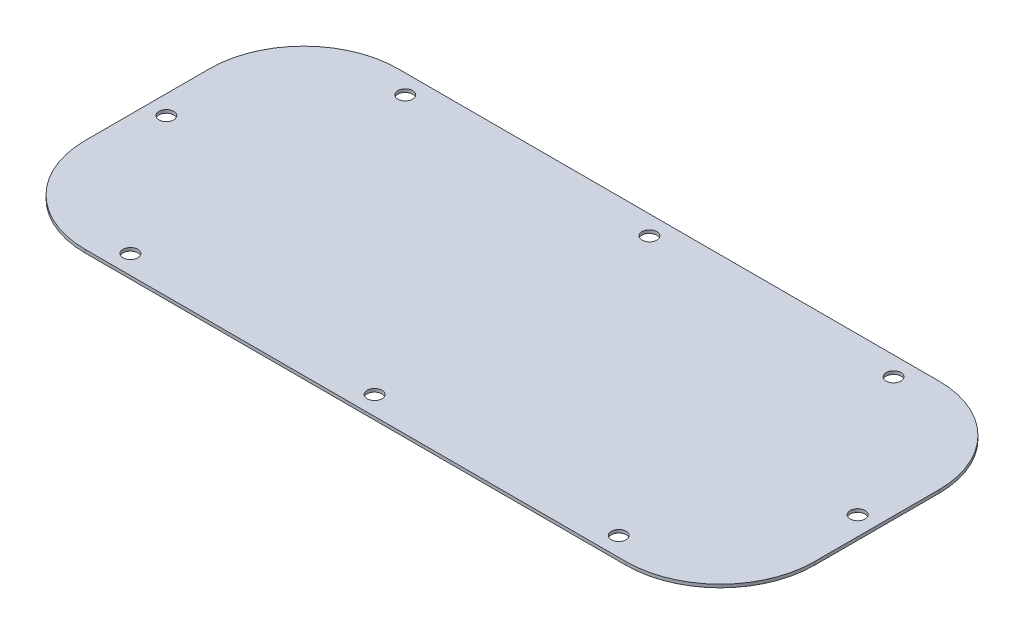
ISO-10303-21;
HEADER;
FILE_DESCRIPTION(('STEP AP214'),'2;1');
FILE_NAME('part.step','',(''),(''),'','','');
FILE_SCHEMA(('AUTOMOTIVE_DESIGN { 1 0 10303 214 1 1 1 1 }'));
ENDSEC;
DATA;
#1=APPLICATION_CONTEXT('core data for automotive mechanical design processes');
#2=APPLICATION_PROTOCOL_DEFINITION('international standard','automotive_design',2000,#1);
#3=PRODUCT_CONTEXT('',#1,'mechanical');
#4=PRODUCT('Part','Part','',(#3));
#5=PRODUCT_RELATED_PRODUCT_CATEGORY('part','',(#4));
#6=PRODUCT_DEFINITION_FORMATION('','',#4);
#7=PRODUCT_DEFINITION_CONTEXT('part definition',#1,'design');
#8=PRODUCT_DEFINITION('design','',#6,#7);
#9=PRODUCT_DEFINITION_SHAPE('','',#8);
#10=(LENGTH_UNIT() NAMED_UNIT(*) SI_UNIT(.MILLI.,.METRE.));
#11=(NAMED_UNIT(*) PLANE_ANGLE_UNIT() SI_UNIT($,.RADIAN.));
#12=(NAMED_UNIT(*) SI_UNIT($,.STERADIAN.) SOLID_ANGLE_UNIT());
#13=UNCERTAINTY_MEASURE_WITH_UNIT(LENGTH_MEASURE(1.E-05),#10,'distance_accuracy_value','');
#14=(GEOMETRIC_REPRESENTATION_CONTEXT(3) GLOBAL_UNCERTAINTY_ASSIGNED_CONTEXT((#13)) GLOBAL_UNIT_ASSIGNED_CONTEXT((#10,
#11,#12)) REPRESENTATION_CONTEXT('',''));
#15=CARTESIAN_POINT('',(0.,0.,0.));
#16=DIRECTION('',(0.,0.,1.));
#17=DIRECTION('',(1.,0.,0.));
#18=AXIS2_PLACEMENT_3D('',#15,#16,#17);
#19=CARTESIAN_POINT('',(72.,-1.5,118.5));
#20=DIRECTION('',(0.,1.,0.));
#21=DIRECTION('',(0.,0.,1.));
#22=AXIS2_PLACEMENT_3D('',#19,#20,#21);
#23=PLANE('',#22);
#24=DIRECTION('',(0.,0.,1.));
#25=VECTOR('',#24,1.);
#26=CARTESIAN_POINT('',(27.5,-1.5,118.5));
#27=LINE('',#26,#25);
#28=CARTESIAN_POINT('',(27.5,-1.5,59.5));
#29=VERTEX_POINT('',#28);
#30=CARTESIAN_POINT('',(27.5,-1.5,118.5));
#31=VERTEX_POINT('',#30);
#32=EDGE_CURVE('E84',#29,#31,#27,.T.);
#33=ORIENTED_EDGE('',*,*,#32,.F.);
#34=CARTESIAN_POINT('',(72.,-1.5,59.5));
#35=DIRECTION('',(0.,-1.,0.));
#36=DIRECTION('',(0.,0.,-1.));
#37=AXIS2_PLACEMENT_3D('',#34,#35,#36);
#38=CIRCLE('',#37,44.5);
#39=CARTESIAN_POINT('',(72.,-1.5,15.));
#40=VERTEX_POINT('',#39);
#41=EDGE_CURVE('E103',#40,#29,#38,.F.);
#42=ORIENTED_EDGE('',*,*,#41,.F.);
#43=DIRECTION('',(1.,0.,0.));
#44=VECTOR('',#43,1.);
#45=CARTESIAN_POINT('',(328.,-1.5,15.));
#46=LINE('',#45,#44);
#47=CARTESIAN_POINT('',(328.,-1.5,15.));
#48=VERTEX_POINT('',#47);
#49=EDGE_CURVE('E108',#40,#48,#46,.T.);
#50=ORIENTED_EDGE('',*,*,#49,.T.);
#51=CARTESIAN_POINT('',(328.,-1.5,59.5));
#52=DIRECTION('',(0.,-1.,0.));
#53=DIRECTION('',(0.,0.,-1.));
#54=AXIS2_PLACEMENT_3D('',#51,#52,#53);
#55=CIRCLE('',#54,44.5);
#56=CARTESIAN_POINT('',(372.5,-1.5,59.5));
#57=VERTEX_POINT('',#56);
#58=EDGE_CURVE('E115',#57,#48,#55,.F.);
#59=ORIENTED_EDGE('',*,*,#58,.F.);
#60=DIRECTION('',(0.,0.,1.));
#61=VECTOR('',#60,1.);
#62=CARTESIAN_POINT('',(372.5,-1.5,118.5));
#63=LINE('',#62,#61);
#64=CARTESIAN_POINT('',(372.5,-1.5,118.5));
#65=VERTEX_POINT('',#64);
#66=EDGE_CURVE('E112',#57,#65,#63,.T.);
#67=ORIENTED_EDGE('',*,*,#66,.T.);
#68=CARTESIAN_POINT('',(328.,-1.5,118.5));
#69=DIRECTION('',(0.,-1.,0.));
#70=DIRECTION('',(0.,0.,-1.));
#71=AXIS2_PLACEMENT_3D('',#68,#69,#70);
#72=CIRCLE('',#71,44.5);
#73=CARTESIAN_POINT('',(328.,-1.5,163.));
#74=VERTEX_POINT('',#73);
#75=EDGE_CURVE('E118',#74,#65,#72,.F.);
#76=ORIENTED_EDGE('',*,*,#75,.F.);
#77=DIRECTION('',(1.,0.,0.));
#78=VECTOR('',#77,1.);
#79=CARTESIAN_POINT('',(72.,-1.5,163.));
#80=LINE('',#79,#78);
#81=CARTESIAN_POINT('',(72.,-1.5,163.));
#82=VERTEX_POINT('',#81);
#83=EDGE_CURVE('E86',#74,#82,#80,.F.);
#84=ORIENTED_EDGE('',*,*,#83,.T.);
#85=CARTESIAN_POINT('',(72.,-1.5,118.5));
#86=DIRECTION('',(0.,-1.,0.));
#87=DIRECTION('',(0.,0.,-1.));
#88=AXIS2_PLACEMENT_3D('',#85,#86,#87);
#89=CIRCLE('',#88,44.5);
#90=EDGE_CURVE('E80',#31,#82,#89,.F.);
#91=ORIENTED_EDGE('',*,*,#90,.F.);
#92=EDGE_LOOP('',(#33,#42,#50,#59,#67,#76,#84,#91));
#93=FACE_BOUND('',#92,.T.);
#94=CARTESIAN_POINT('',(36.5,-1.5,89.));
#95=DIRECTION('',(0.,1.,0.));
#96=DIRECTION('',(0.,0.,1.));
#97=AXIS2_PLACEMENT_3D('',#94,#95,#96);
#98=CIRCLE('',#97,3.5);
#99=CARTESIAN_POINT('',(36.5,-1.5,92.5));
#100=VERTEX_POINT('',#99);
#101=EDGE_CURVE('E90',#100,#100,#98,.T.);
#102=ORIENTED_EDGE('',*,*,#101,.T.);
#103=EDGE_LOOP('',(#102));
#104=FACE_BOUND('',#103,.T.);
#105=CARTESIAN_POINT('',(363.5,-1.5,89.));
#106=DIRECTION('',(0.,1.,0.));
#107=DIRECTION('',(0.,0.,1.));
#108=AXIS2_PLACEMENT_3D('',#105,#106,#107);
#109=CIRCLE('',#108,3.5);
#110=CARTESIAN_POINT('',(363.5,-1.5,92.5));
#111=VERTEX_POINT('',#110);
#112=EDGE_CURVE('E162',#111,#111,#109,.T.);
#113=ORIENTED_EDGE('',*,*,#112,.T.);
#114=EDGE_LOOP('',(#113));
#115=FACE_BOUND('',#114,.T.);
#116=CARTESIAN_POINT('',(84.5,-1.5,24.));
#117=DIRECTION('',(0.,1.,0.));
#118=DIRECTION('',(0.,0.,1.));
#119=AXIS2_PLACEMENT_3D('',#116,#117,#118);
#120=CIRCLE('',#119,3.5);
#121=CARTESIAN_POINT('',(84.5,-1.5,27.5));
#122=VERTEX_POINT('',#121);
#123=EDGE_CURVE('E165',#122,#122,#120,.T.);
#124=ORIENTED_EDGE('',*,*,#123,.T.);
#125=EDGE_LOOP('',(#124));
#126=FACE_BOUND('',#125,.T.);
#127=CARTESIAN_POINT('',(84.5,-1.5,154.));
#128=DIRECTION('',(0.,1.,0.));
#129=DIRECTION('',(0.,0.,1.));
#130=AXIS2_PLACEMENT_3D('',#127,#128,#129);
#131=CIRCLE('',#130,3.5);
#132=CARTESIAN_POINT('',(84.5,-1.5,157.5));
#133=VERTEX_POINT('',#132);
#134=EDGE_CURVE('E168',#133,#133,#131,.T.);
#135=ORIENTED_EDGE('',*,*,#134,.T.);
#136=EDGE_LOOP('',(#135));
#137=FACE_BOUND('',#136,.T.);
#138=CARTESIAN_POINT('',(200.,-1.5,24.));
#139=DIRECTION('',(0.,1.,0.));
#140=DIRECTION('',(0.,0.,1.));
#141=AXIS2_PLACEMENT_3D('',#138,#139,#140);
#142=CIRCLE('',#141,3.5);
#143=CARTESIAN_POINT('',(200.,-1.5,27.5));
#144=VERTEX_POINT('',#143);
#145=EDGE_CURVE('E171',#144,#144,#142,.T.);
#146=ORIENTED_EDGE('',*,*,#145,.T.);
#147=EDGE_LOOP('',(#146));
#148=FACE_BOUND('',#147,.T.);
#149=CARTESIAN_POINT('',(200.,-1.5,154.));
#150=DIRECTION('',(0.,1.,0.));
#151=DIRECTION('',(0.,0.,1.));
#152=AXIS2_PLACEMENT_3D('',#149,#150,#151);
#153=CIRCLE('',#152,3.5);
#154=CARTESIAN_POINT('',(200.,-1.5,157.5));
#155=VERTEX_POINT('',#154);
#156=EDGE_CURVE('E174',#155,#155,#153,.T.);
#157=ORIENTED_EDGE('',*,*,#156,.T.);
#158=EDGE_LOOP('',(#157));
#159=FACE_BOUND('',#158,.T.);
#160=CARTESIAN_POINT('',(315.5,-1.5,24.));
#161=DIRECTION('',(0.,1.,0.));
#162=DIRECTION('',(0.,0.,1.));
#163=AXIS2_PLACEMENT_3D('',#160,#161,#162);
#164=CIRCLE('',#163,3.5);
#165=CARTESIAN_POINT('',(315.5,-1.5,27.5));
#166=VERTEX_POINT('',#165);
#167=EDGE_CURVE('E176',#166,#166,#164,.T.);
#168=ORIENTED_EDGE('',*,*,#167,.T.);
#169=EDGE_LOOP('',(#168));
#170=FACE_BOUND('',#169,.T.);
#171=CARTESIAN_POINT('',(315.5,-1.5,154.));
#172=DIRECTION('',(0.,1.,0.));
#173=DIRECTION('',(0.,0.,1.));
#174=AXIS2_PLACEMENT_3D('',#171,#172,#173);
#175=CIRCLE('',#174,3.5);
#176=CARTESIAN_POINT('',(315.5,-1.5,157.5));
#177=VERTEX_POINT('',#176);
#178=EDGE_CURVE('E20',#177,#177,#175,.T.);
#179=ORIENTED_EDGE('',*,*,#178,.T.);
#180=EDGE_LOOP('',(#179));
#181=FACE_BOUND('',#180,.T.);
#182=ADVANCED_FACE('F17',(#93,#104,#115,#126,#137,#148,#159,#170,#181),#23,.F.);
#183=CARTESIAN_POINT('',(315.5,-3.7,154.));
#184=DIRECTION('',(0.,1.,0.));
#185=DIRECTION('',(0.,0.,1.));
#186=AXIS2_PLACEMENT_3D('',#183,#184,#185);
#187=CYLINDRICAL_SURFACE('',#186,3.5);
#188=CARTESIAN_POINT('',(315.5,0.,154.));
#189=DIRECTION('',(0.,1.,0.));
#190=DIRECTION('',(0.,0.,1.));
#191=AXIS2_PLACEMENT_3D('',#188,#189,#190);
#192=CIRCLE('',#191,3.5);
#193=CARTESIAN_POINT('',(315.5,0.,157.5));
#194=VERTEX_POINT('',#193);
#195=EDGE_CURVE('E152',#194,#194,#192,.F.);
#196=ORIENTED_EDGE('',*,*,#195,.F.);
#197=EDGE_LOOP('',(#196));
#198=FACE_BOUND('',#197,.T.);
#199=ORIENTED_EDGE('',*,*,#178,.F.);
#200=EDGE_LOOP('',(#199));
#201=FACE_BOUND('',#200,.T.);
#202=ADVANCED_FACE('F184',(#198,#201),#187,.F.);
#203=CARTESIAN_POINT('',(315.5,-3.7,24.));
#204=DIRECTION('',(0.,1.,0.));
#205=DIRECTION('',(0.,0.,1.));
#206=AXIS2_PLACEMENT_3D('',#203,#204,#205);
#207=CYLINDRICAL_SURFACE('',#206,3.5);
#208=CARTESIAN_POINT('',(315.5,0.,24.));
#209=DIRECTION('',(0.,1.,0.));
#210=DIRECTION('',(0.,0.,1.));
#211=AXIS2_PLACEMENT_3D('',#208,#209,#210);
#212=CIRCLE('',#211,3.5);
#213=CARTESIAN_POINT('',(315.5,0.,27.5));
#214=VERTEX_POINT('',#213);
#215=EDGE_CURVE('E149',#214,#214,#212,.F.);
#216=ORIENTED_EDGE('',*,*,#215,.F.);
#217=EDGE_LOOP('',(#216));
#218=FACE_BOUND('',#217,.T.);
#219=ORIENTED_EDGE('',*,*,#167,.F.);
#220=EDGE_LOOP('',(#219));
#221=FACE_BOUND('',#220,.T.);
#222=ADVANCED_FACE('F186',(#218,#221),#207,.F.);
#223=CARTESIAN_POINT('',(200.,-3.7,154.));
#224=DIRECTION('',(0.,1.,0.));
#225=DIRECTION('',(0.,0.,1.));
#226=AXIS2_PLACEMENT_3D('',#223,#224,#225);
#227=CYLINDRICAL_SURFACE('',#226,3.5);
#228=CARTESIAN_POINT('',(200.,0.,154.));
#229=DIRECTION('',(0.,1.,0.));
#230=DIRECTION('',(0.,0.,1.));
#231=AXIS2_PLACEMENT_3D('',#228,#229,#230);
#232=CIRCLE('',#231,3.5);
#233=CARTESIAN_POINT('',(200.,0.,157.5));
#234=VERTEX_POINT('',#233);
#235=EDGE_CURVE('E146',#234,#234,#232,.F.);
#236=ORIENTED_EDGE('',*,*,#235,.F.);
#237=EDGE_LOOP('',(#236));
#238=FACE_BOUND('',#237,.T.);
#239=ORIENTED_EDGE('',*,*,#156,.F.);
#240=EDGE_LOOP('',(#239));
#241=FACE_BOUND('',#240,.T.);
#242=ADVANCED_FACE('F193',(#238,#241),#227,.F.);
#243=CARTESIAN_POINT('',(200.,-3.7,24.));
#244=DIRECTION('',(0.,1.,0.));
#245=DIRECTION('',(0.,0.,1.));
#246=AXIS2_PLACEMENT_3D('',#243,#244,#245);
#247=CYLINDRICAL_SURFACE('',#246,3.5);
#248=CARTESIAN_POINT('',(200.,0.,24.));
#249=DIRECTION('',(0.,1.,0.));
#250=DIRECTION('',(0.,0.,1.));
#251=AXIS2_PLACEMENT_3D('',#248,#249,#250);
#252=CIRCLE('',#251,3.5);
#253=CARTESIAN_POINT('',(200.,0.,27.5));
#254=VERTEX_POINT('',#253);
#255=EDGE_CURVE('E143',#254,#254,#252,.F.);
#256=ORIENTED_EDGE('',*,*,#255,.F.);
#257=EDGE_LOOP('',(#256));
#258=FACE_BOUND('',#257,.T.);
#259=ORIENTED_EDGE('',*,*,#145,.F.);
#260=EDGE_LOOP('',(#259));
#261=FACE_BOUND('',#260,.T.);
#262=ADVANCED_FACE('F247',(#258,#261),#247,.F.);
#263=CARTESIAN_POINT('',(84.5,-3.7,154.));
#264=DIRECTION('',(0.,1.,0.));
#265=DIRECTION('',(0.,0.,1.));
#266=AXIS2_PLACEMENT_3D('',#263,#264,#265);
#267=CYLINDRICAL_SURFACE('',#266,3.5);
#268=CARTESIAN_POINT('',(84.5,0.,154.));
#269=DIRECTION('',(0.,1.,0.));
#270=DIRECTION('',(0.,0.,1.));
#271=AXIS2_PLACEMENT_3D('',#268,#269,#270);
#272=CIRCLE('',#271,3.5);
#273=CARTESIAN_POINT('',(84.5,0.,157.5));
#274=VERTEX_POINT('',#273);
#275=EDGE_CURVE('E140',#274,#274,#272,.F.);
#276=ORIENTED_EDGE('',*,*,#275,.F.);
#277=EDGE_LOOP('',(#276));
#278=FACE_BOUND('',#277,.T.);
#279=ORIENTED_EDGE('',*,*,#134,.F.);
#280=EDGE_LOOP('',(#279));
#281=FACE_BOUND('',#280,.T.);
#282=ADVANCED_FACE('F243',(#278,#281),#267,.F.);
#283=CARTESIAN_POINT('',(84.5,-3.7,24.));
#284=DIRECTION('',(0.,1.,0.));
#285=DIRECTION('',(0.,0.,1.));
#286=AXIS2_PLACEMENT_3D('',#283,#284,#285);
#287=CYLINDRICAL_SURFACE('',#286,3.5);
#288=CARTESIAN_POINT('',(84.5,0.,24.));
#289=DIRECTION('',(0.,1.,0.));
#290=DIRECTION('',(0.,0.,1.));
#291=AXIS2_PLACEMENT_3D('',#288,#289,#290);
#292=CIRCLE('',#291,3.5);
#293=CARTESIAN_POINT('',(84.5,0.,27.5));
#294=VERTEX_POINT('',#293);
#295=EDGE_CURVE('E137',#294,#294,#292,.F.);
#296=ORIENTED_EDGE('',*,*,#295,.F.);
#297=EDGE_LOOP('',(#296));
#298=FACE_BOUND('',#297,.T.);
#299=ORIENTED_EDGE('',*,*,#123,.F.);
#300=EDGE_LOOP('',(#299));
#301=FACE_BOUND('',#300,.T.);
#302=ADVANCED_FACE('F239',(#298,#301),#287,.F.);
#303=CARTESIAN_POINT('',(363.5,-3.7,89.));
#304=DIRECTION('',(0.,1.,0.));
#305=DIRECTION('',(0.,0.,1.));
#306=AXIS2_PLACEMENT_3D('',#303,#304,#305);
#307=CYLINDRICAL_SURFACE('',#306,3.5);
#308=CARTESIAN_POINT('',(363.5,0.,89.));
#309=DIRECTION('',(0.,1.,0.));
#310=DIRECTION('',(0.,0.,1.));
#311=AXIS2_PLACEMENT_3D('',#308,#309,#310);
#312=CIRCLE('',#311,3.5);
#313=CARTESIAN_POINT('',(363.5,0.,92.5));
#314=VERTEX_POINT('',#313);
#315=EDGE_CURVE('E134',#314,#314,#312,.F.);
#316=ORIENTED_EDGE('',*,*,#315,.F.);
#317=EDGE_LOOP('',(#316));
#318=FACE_BOUND('',#317,.T.);
#319=ORIENTED_EDGE('',*,*,#112,.F.);
#320=EDGE_LOOP('',(#319));
#321=FACE_BOUND('',#320,.T.);
#322=ADVANCED_FACE('F235',(#318,#321),#307,.F.);
#323=CARTESIAN_POINT('',(36.5,-3.7,89.));
#324=DIRECTION('',(0.,1.,0.));
#325=DIRECTION('',(0.,0.,1.));
#326=AXIS2_PLACEMENT_3D('',#323,#324,#325);
#327=CYLINDRICAL_SURFACE('',#326,3.5);
#328=CARTESIAN_POINT('',(36.5,0.,89.));
#329=DIRECTION('',(0.,1.,0.));
#330=DIRECTION('',(0.,0.,1.));
#331=AXIS2_PLACEMENT_3D('',#328,#329,#330);
#332=CIRCLE('',#331,3.5);
#333=CARTESIAN_POINT('',(36.5,0.,92.5));
#334=VERTEX_POINT('',#333);
#335=EDGE_CURVE('E131',#334,#334,#332,.F.);
#336=ORIENTED_EDGE('',*,*,#335,.F.);
#337=EDGE_LOOP('',(#336));
#338=FACE_BOUND('',#337,.T.);
#339=ORIENTED_EDGE('',*,*,#101,.F.);
#340=EDGE_LOOP('',(#339));
#341=FACE_BOUND('',#340,.T.);
#342=ADVANCED_FACE('F232',(#338,#341),#327,.F.);
#343=CARTESIAN_POINT('',(72.,0.,118.5));
#344=DIRECTION('',(0.,-1.,0.));
#345=DIRECTION('',(0.,0.,-1.));
#346=AXIS2_PLACEMENT_3D('',#343,#344,#345);
#347=CYLINDRICAL_SURFACE('',#346,44.5);
#348=CARTESIAN_POINT('',(72.,0.,118.5));
#349=DIRECTION('',(0.,-1.,0.));
#350=DIRECTION('',(0.,0.,-1.));
#351=AXIS2_PLACEMENT_3D('',#348,#349,#350);
#352=CIRCLE('',#351,44.5);
#353=CARTESIAN_POINT('',(27.5,0.,118.5));
#354=VERTEX_POINT('',#353);
#355=CARTESIAN_POINT('',(72.,0.,163.));
#356=VERTEX_POINT('',#355);
#357=EDGE_CURVE('E96',#354,#356,#352,.F.);
#358=ORIENTED_EDGE('',*,*,#357,.F.);
#359=DIRECTION('',(0.,1.,0.));
#360=VECTOR('',#359,1.);
#361=CARTESIAN_POINT('',(27.5,0.,118.5));
#362=LINE('',#361,#360);
#363=EDGE_CURVE('E93',#31,#354,#362,.T.);
#364=ORIENTED_EDGE('',*,*,#363,.F.);
#365=ORIENTED_EDGE('',*,*,#90,.T.);
#366=DIRECTION('',(0.,1.,0.));
#367=VECTOR('',#366,1.);
#368=CARTESIAN_POINT('',(72.,0.,163.));
#369=LINE('',#368,#367);
#370=EDGE_CURVE('E89',#82,#356,#369,.T.);
#371=ORIENTED_EDGE('',*,*,#370,.T.);
#372=EDGE_LOOP('',(#358,#364,#365,#371));
#373=FACE_BOUND('',#372,.T.);
#374=ADVANCED_FACE('F94',(#373),#347,.T.);
#375=CARTESIAN_POINT('',(72.,0.,163.));
#376=DIRECTION('',(0.,0.,-1.));
#377=DIRECTION('',(0.,1.,0.));
#378=AXIS2_PLACEMENT_3D('',#375,#376,#377);
#379=PLANE('',#378);
#380=DIRECTION('',(0.,-1.,0.));
#381=VECTOR('',#380,1.);
#382=CARTESIAN_POINT('',(328.,0.,163.));
#383=LINE('',#382,#381);
#384=CARTESIAN_POINT('',(328.,0.,163.));
#385=VERTEX_POINT('',#384);
#386=EDGE_CURVE('E158',#385,#74,#383,.T.);
#387=ORIENTED_EDGE('',*,*,#386,.F.);
#388=DIRECTION('',(1.,0.,0.));
#389=VECTOR('',#388,1.);
#390=CARTESIAN_POINT('',(72.,0.,163.));
#391=LINE('',#390,#389);
#392=EDGE_CURVE('E129',#356,#385,#391,.T.);
#393=ORIENTED_EDGE('',*,*,#392,.F.);
#394=ORIENTED_EDGE('',*,*,#370,.F.);
#395=ORIENTED_EDGE('',*,*,#83,.F.);
#396=EDGE_LOOP('',(#387,#393,#394,#395));
#397=FACE_BOUND('',#396,.T.);
#398=ADVANCED_FACE('F225',(#397),#379,.F.);
#399=CARTESIAN_POINT('',(328.,0.,118.5));
#400=DIRECTION('',(0.,-1.,0.));
#401=DIRECTION('',(0.,0.,-1.));
#402=AXIS2_PLACEMENT_3D('',#399,#400,#401);
#403=CYLINDRICAL_SURFACE('',#402,44.5);
#404=CARTESIAN_POINT('',(328.,0.,118.5));
#405=DIRECTION('',(0.,-1.,0.));
#406=DIRECTION('',(0.,0.,-1.));
#407=AXIS2_PLACEMENT_3D('',#404,#405,#406);
#408=CIRCLE('',#407,44.5);
#409=CARTESIAN_POINT('',(372.5,0.,118.5));
#410=VERTEX_POINT('',#409);
#411=EDGE_CURVE('E126',#385,#410,#408,.F.);
#412=ORIENTED_EDGE('',*,*,#411,.F.);
#413=ORIENTED_EDGE('',*,*,#386,.T.);
#414=ORIENTED_EDGE('',*,*,#75,.T.);
#415=DIRECTION('',(0.,1.,0.));
#416=VECTOR('',#415,1.);
#417=CARTESIAN_POINT('',(372.5,0.,118.5));
#418=LINE('',#417,#416);
#419=EDGE_CURVE('E116',#65,#410,#418,.T.);
#420=ORIENTED_EDGE('',*,*,#419,.T.);
#421=EDGE_LOOP('',(#412,#413,#414,#420));
#422=FACE_BOUND('',#421,.T.);
#423=ADVANCED_FACE('F221',(#422),#403,.T.);
#424=CARTESIAN_POINT('',(372.5,0.,118.5));
#425=DIRECTION('',(-1.,0.,0.));
#426=DIRECTION('',(0.,0.,1.));
#427=AXIS2_PLACEMENT_3D('',#424,#425,#426);
#428=PLANE('',#427);
#429=DIRECTION('',(0.,-1.,0.));
#430=VECTOR('',#429,1.);
#431=CARTESIAN_POINT('',(372.5,0.,59.5));
#432=LINE('',#431,#430);
#433=CARTESIAN_POINT('',(372.5,0.,59.5));
#434=VERTEX_POINT('',#433);
#435=EDGE_CURVE('E157',#434,#57,#432,.T.);
#436=ORIENTED_EDGE('',*,*,#435,.F.);
#437=DIRECTION('',(0.,0.,1.));
#438=VECTOR('',#437,1.);
#439=CARTESIAN_POINT('',(372.5,0.,118.5));
#440=LINE('',#439,#438);
#441=EDGE_CURVE('E125',#410,#434,#440,.F.);
#442=ORIENTED_EDGE('',*,*,#441,.F.);
#443=ORIENTED_EDGE('',*,*,#419,.F.);
#444=ORIENTED_EDGE('',*,*,#66,.F.);
#445=EDGE_LOOP('',(#436,#442,#443,#444));
#446=FACE_BOUND('',#445,.T.);
#447=ADVANCED_FACE('F217',(#446),#428,.F.);
#448=CARTESIAN_POINT('',(328.,0.,59.5));
#449=DIRECTION('',(0.,-1.,0.));
#450=DIRECTION('',(0.,0.,-1.));
#451=AXIS2_PLACEMENT_3D('',#448,#449,#450);
#452=CYLINDRICAL_SURFACE('',#451,44.5);
#453=CARTESIAN_POINT('',(328.,0.,59.5));
#454=DIRECTION('',(0.,-1.,0.));
#455=DIRECTION('',(0.,0.,-1.));
#456=AXIS2_PLACEMENT_3D('',#453,#454,#455);
#457=CIRCLE('',#456,44.5);
#458=CARTESIAN_POINT('',(328.,0.,15.));
#459=VERTEX_POINT('',#458);
#460=EDGE_CURVE('E122',#434,#459,#457,.F.);
#461=ORIENTED_EDGE('',*,*,#460,.F.);
#462=ORIENTED_EDGE('',*,*,#435,.T.);
#463=ORIENTED_EDGE('',*,*,#58,.T.);
#464=DIRECTION('',(0.,-1.,0.));
#465=VECTOR('',#464,1.);
#466=CARTESIAN_POINT('',(328.,0.,15.));
#467=LINE('',#466,#465);
#468=EDGE_CURVE('E111',#48,#459,#467,.F.);
#469=ORIENTED_EDGE('',*,*,#468,.T.);
#470=EDGE_LOOP('',(#461,#462,#463,#469));
#471=FACE_BOUND('',#470,.T.);
#472=ADVANCED_FACE('F213',(#471),#452,.T.);
#473=CARTESIAN_POINT('',(328.,0.,15.));
#474=DIRECTION('',(0.,0.,1.));
#475=DIRECTION('',(0.,-1.,0.));
#476=AXIS2_PLACEMENT_3D('',#473,#474,#475);
#477=PLANE('',#476);
#478=DIRECTION('',(0.,-1.,0.));
#479=VECTOR('',#478,1.);
#480=CARTESIAN_POINT('',(72.,0.,15.));
#481=LINE('',#480,#479);
#482=CARTESIAN_POINT('',(72.,0.,15.));
#483=VERTEX_POINT('',#482);
#484=EDGE_CURVE('E100',#483,#40,#481,.T.);
#485=ORIENTED_EDGE('',*,*,#484,.F.);
#486=DIRECTION('',(1.,0.,0.));
#487=VECTOR('',#486,1.);
#488=CARTESIAN_POINT('',(72.,0.,15.));
#489=LINE('',#488,#487);
#490=EDGE_CURVE('E121',#459,#483,#489,.F.);
#491=ORIENTED_EDGE('',*,*,#490,.F.);
#492=ORIENTED_EDGE('',*,*,#468,.F.);
#493=ORIENTED_EDGE('',*,*,#49,.F.);
#494=EDGE_LOOP('',(#485,#491,#492,#493));
#495=FACE_BOUND('',#494,.T.);
#496=ADVANCED_FACE('F210',(#495),#477,.F.);
#497=CARTESIAN_POINT('',(72.,0.,59.5));
#498=DIRECTION('',(0.,-1.,0.));
#499=DIRECTION('',(0.,0.,-1.));
#500=AXIS2_PLACEMENT_3D('',#497,#498,#499);
#501=CYLINDRICAL_SURFACE('',#500,44.5);
#502=CARTESIAN_POINT('',(72.,0.,59.5));
#503=DIRECTION('',(0.,-1.,0.));
#504=DIRECTION('',(0.,0.,-1.));
#505=AXIS2_PLACEMENT_3D('',#502,#503,#504);
#506=CIRCLE('',#505,44.5);
#507=CARTESIAN_POINT('',(27.5,0.,59.5));
#508=VERTEX_POINT('',#507);
#509=EDGE_CURVE('E26',#483,#508,#506,.F.);
#510=ORIENTED_EDGE('',*,*,#509,.F.);
#511=ORIENTED_EDGE('',*,*,#484,.T.);
#512=ORIENTED_EDGE('',*,*,#41,.T.);
#513=DIRECTION('',(0.,1.,0.));
#514=VECTOR('',#513,1.);
#515=CARTESIAN_POINT('',(27.5,0.,59.5));
#516=LINE('',#515,#514);
#517=EDGE_CURVE('E35',#508,#29,#516,.F.);
#518=ORIENTED_EDGE('',*,*,#517,.F.);
#519=EDGE_LOOP('',(#510,#511,#512,#518));
#520=FACE_BOUND('',#519,.T.);
#521=ADVANCED_FACE('F204',(#520),#501,.T.);
#522=CARTESIAN_POINT('',(27.5,0.,118.5));
#523=DIRECTION('',(-1.,0.,0.));
#524=DIRECTION('',(0.,0.,1.));
#525=AXIS2_PLACEMENT_3D('',#522,#523,#524);
#526=PLANE('',#525);
#527=DIRECTION('',(0.,0.,1.));
#528=VECTOR('',#527,1.);
#529=CARTESIAN_POINT('',(27.5,0.,118.5));
#530=LINE('',#529,#528);
#531=EDGE_CURVE('E11',#508,#354,#530,.T.);
#532=ORIENTED_EDGE('',*,*,#531,.F.);
#533=ORIENTED_EDGE('',*,*,#517,.T.);
#534=ORIENTED_EDGE('',*,*,#32,.T.);
#535=ORIENTED_EDGE('',*,*,#363,.T.);
#536=EDGE_LOOP('',(#532,#533,#534,#535));
#537=FACE_BOUND('',#536,.T.);
#538=ADVANCED_FACE('F99',(#537),#526,.T.);
#539=CARTESIAN_POINT('',(72.,0.,118.5));
#540=DIRECTION('',(0.,1.,0.));
#541=DIRECTION('',(0.,0.,1.));
#542=AXIS2_PLACEMENT_3D('',#539,#540,#541);
#543=PLANE('',#542);
#544=ORIENTED_EDGE('',*,*,#509,.T.);
#545=ORIENTED_EDGE('',*,*,#531,.T.);
#546=ORIENTED_EDGE('',*,*,#357,.T.);
#547=ORIENTED_EDGE('',*,*,#392,.T.);
#548=ORIENTED_EDGE('',*,*,#411,.T.);
#549=ORIENTED_EDGE('',*,*,#441,.T.);
#550=ORIENTED_EDGE('',*,*,#460,.T.);
#551=ORIENTED_EDGE('',*,*,#490,.T.);
#552=EDGE_LOOP('',(#544,#545,#546,#547,#548,#549,#550,#551));
#553=FACE_BOUND('',#552,.T.);
#554=ORIENTED_EDGE('',*,*,#335,.T.);
#555=EDGE_LOOP('',(#554));
#556=FACE_BOUND('',#555,.T.);
#557=ORIENTED_EDGE('',*,*,#315,.T.);
#558=EDGE_LOOP('',(#557));
#559=FACE_BOUND('',#558,.T.);
#560=ORIENTED_EDGE('',*,*,#295,.T.);
#561=EDGE_LOOP('',(#560));
#562=FACE_BOUND('',#561,.T.);
#563=ORIENTED_EDGE('',*,*,#275,.T.);
#564=EDGE_LOOP('',(#563));
#565=FACE_BOUND('',#564,.T.);
#566=ORIENTED_EDGE('',*,*,#255,.T.);
#567=EDGE_LOOP('',(#566));
#568=FACE_BOUND('',#567,.T.);
#569=ORIENTED_EDGE('',*,*,#235,.T.);
#570=EDGE_LOOP('',(#569));
#571=FACE_BOUND('',#570,.T.);
#572=ORIENTED_EDGE('',*,*,#215,.T.);
#573=EDGE_LOOP('',(#572));
#574=FACE_BOUND('',#573,.T.);
#575=ORIENTED_EDGE('',*,*,#195,.T.);
#576=EDGE_LOOP('',(#575));
#577=FACE_BOUND('',#576,.T.);
#578=ADVANCED_FACE('F197',(#553,#556,#559,#562,#565,#568,#571,#574,#577),#543,.T.);
#579=CLOSED_SHELL('',(#182,#202,#222,#242,#262,#282,#302,#322,#342,#374,#398,#423,#447,#472,
#496,#521,#538,#578));
#580=MANIFOLD_SOLID_BREP('B1',#579);
#581=ADVANCED_BREP_SHAPE_REPRESENTATION('',(#18,#580),#14);
#582=SHAPE_DEFINITION_REPRESENTATION(#9,#581);
ENDSEC;
END-ISO-10303-21;
